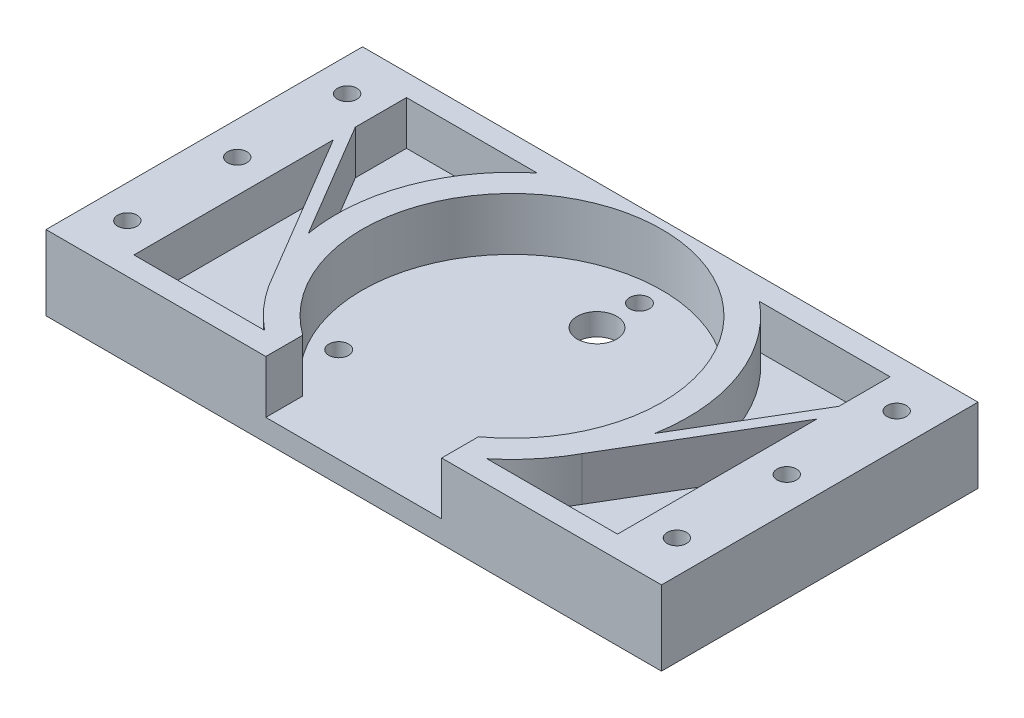
ISO-10303-21;
HEADER;
FILE_DESCRIPTION(('STEP AP214'),'2;1');
FILE_NAME('part.step','',(''),(''),'','','');
FILE_SCHEMA(('AUTOMOTIVE_DESIGN { 1 0 10303 214 1 1 1 1 }'));
ENDSEC;
DATA;
#1=APPLICATION_CONTEXT('core data for automotive mechanical design processes');
#2=APPLICATION_PROTOCOL_DEFINITION('international standard','automotive_design',2000,#1);
#3=PRODUCT_CONTEXT('',#1,'mechanical');
#4=PRODUCT('Part','Part','',(#3));
#5=PRODUCT_RELATED_PRODUCT_CATEGORY('part','',(#4));
#6=PRODUCT_DEFINITION_FORMATION('','',#4);
#7=PRODUCT_DEFINITION_CONTEXT('part definition',#1,'design');
#8=PRODUCT_DEFINITION('design','',#6,#7);
#9=PRODUCT_DEFINITION_SHAPE('','',#8);
#10=(LENGTH_UNIT() NAMED_UNIT(*) SI_UNIT(.MILLI.,.METRE.));
#11=(NAMED_UNIT(*) PLANE_ANGLE_UNIT() SI_UNIT($,.RADIAN.));
#12=(NAMED_UNIT(*) SI_UNIT($,.STERADIAN.) SOLID_ANGLE_UNIT());
#13=UNCERTAINTY_MEASURE_WITH_UNIT(LENGTH_MEASURE(1.E-05),#10,'distance_accuracy_value','');
#14=(GEOMETRIC_REPRESENTATION_CONTEXT(3) GLOBAL_UNCERTAINTY_ASSIGNED_CONTEXT((#13)) GLOBAL_UNIT_ASSIGNED_CONTEXT((#10,
#11,#12)) REPRESENTATION_CONTEXT('',''));
#15=CARTESIAN_POINT('',(0.,0.,0.));
#16=DIRECTION('',(0.,0.,1.));
#17=DIRECTION('',(1.,0.,0.));
#18=AXIS2_PLACEMENT_3D('',#15,#16,#17);
#19=CARTESIAN_POINT('',(70.,17.,-36.));
#20=DIRECTION('',(-1.,0.,0.));
#21=DIRECTION('',(0.,0.,1.));
#22=AXIS2_PLACEMENT_3D('',#19,#20,#21);
#23=PLANE('',#22);
#24=DIRECTION('',(0.,0.,-1.));
#25=VECTOR('',#24,1.);
#26=CARTESIAN_POINT('',(70.,0.,-36.));
#27=LINE('',#26,#25);
#28=CARTESIAN_POINT('',(70.,0.,36.));
#29=VERTEX_POINT('',#28);
#30=CARTESIAN_POINT('',(70.,0.,-36.));
#31=VERTEX_POINT('',#30);
#32=EDGE_CURVE('E498',#29,#31,#27,.T.);
#33=ORIENTED_EDGE('',*,*,#32,.T.);
#34=DIRECTION('',(0.,-1.,0.));
#35=VECTOR('',#34,1.);
#36=CARTESIAN_POINT('',(70.,17.,-36.));
#37=LINE('',#36,#35);
#38=CARTESIAN_POINT('',(70.,17.,-36.));
#39=VERTEX_POINT('',#38);
#40=EDGE_CURVE('E11',#39,#31,#37,.T.);
#41=ORIENTED_EDGE('',*,*,#40,.F.);
#42=DIRECTION('',(0.,0.,-1.));
#43=VECTOR('',#42,1.);
#44=CARTESIAN_POINT('',(70.,17.,-36.));
#45=LINE('',#44,#43);
#46=CARTESIAN_POINT('',(70.,17.,36.));
#47=VERTEX_POINT('',#46);
#48=EDGE_CURVE('E502',#47,#39,#45,.T.);
#49=ORIENTED_EDGE('',*,*,#48,.F.);
#50=DIRECTION('',(0.,-1.,0.));
#51=VECTOR('',#50,1.);
#52=CARTESIAN_POINT('',(70.,17.,36.));
#53=LINE('',#52,#51);
#54=EDGE_CURVE('E518',#47,#29,#53,.T.);
#55=ORIENTED_EDGE('',*,*,#54,.T.);
#56=EDGE_LOOP('',(#33,#41,#49,#55));
#57=FACE_BOUND('',#56,.T.);
#58=ADVANCED_FACE('F39',(#57),#23,.F.);
#59=CARTESIAN_POINT('',(-70.,17.,-36.));
#60=DIRECTION('',(0.,0.,1.));
#61=DIRECTION('',(1.,0.,0.));
#62=AXIS2_PLACEMENT_3D('',#59,#60,#61);
#63=PLANE('',#62);
#64=DIRECTION('',(-1.,0.,0.));
#65=VECTOR('',#64,1.);
#66=CARTESIAN_POINT('',(-70.,0.,-36.));
#67=LINE('',#66,#65);
#68=CARTESIAN_POINT('',(-70.,0.,-36.));
#69=VERTEX_POINT('',#68);
#70=EDGE_CURVE('E522',#31,#69,#67,.T.);
#71=ORIENTED_EDGE('',*,*,#70,.T.);
#72=DIRECTION('',(0.,-1.,0.));
#73=VECTOR('',#72,1.);
#74=CARTESIAN_POINT('',(-70.,17.,-36.));
#75=LINE('',#74,#73);
#76=CARTESIAN_POINT('',(-70.,17.,-36.));
#77=VERTEX_POINT('',#76);
#78=EDGE_CURVE('E47',#77,#69,#75,.T.);
#79=ORIENTED_EDGE('',*,*,#78,.F.);
#80=DIRECTION('',(-1.,0.,0.));
#81=VECTOR('',#80,1.);
#82=CARTESIAN_POINT('',(-70.,17.,-36.));
#83=LINE('',#82,#81);
#84=EDGE_CURVE('E506',#39,#77,#83,.T.);
#85=ORIENTED_EDGE('',*,*,#84,.F.);
#86=ORIENTED_EDGE('',*,*,#40,.T.);
#87=EDGE_LOOP('',(#71,#79,#85,#86));
#88=FACE_BOUND('',#87,.T.);
#89=ADVANCED_FACE('F588',(#88),#63,.F.);
#90=CARTESIAN_POINT('',(-70.,17.,-36.));
#91=DIRECTION('',(1.,0.,0.));
#92=DIRECTION('',(0.,0.,-1.));
#93=AXIS2_PLACEMENT_3D('',#90,#91,#92);
#94=PLANE('',#93);
#95=DIRECTION('',(0.,0.,1.));
#96=VECTOR('',#95,1.);
#97=CARTESIAN_POINT('',(-70.,0.,-36.));
#98=LINE('',#97,#96);
#99=CARTESIAN_POINT('',(-70.,0.,36.));
#100=VERTEX_POINT('',#99);
#101=EDGE_CURVE('E525',#69,#100,#98,.T.);
#102=ORIENTED_EDGE('',*,*,#101,.T.);
#103=DIRECTION('',(0.,-1.,0.));
#104=VECTOR('',#103,1.);
#105=CARTESIAN_POINT('',(-70.,17.,36.));
#106=LINE('',#105,#104);
#107=CARTESIAN_POINT('',(-70.,17.,36.));
#108=VERTEX_POINT('',#107);
#109=EDGE_CURVE('E533',#108,#100,#106,.T.);
#110=ORIENTED_EDGE('',*,*,#109,.F.);
#111=DIRECTION('',(0.,0.,1.));
#112=VECTOR('',#111,1.);
#113=CARTESIAN_POINT('',(-70.,17.,-36.));
#114=LINE('',#113,#112);
#115=EDGE_CURVE('E510',#77,#108,#114,.T.);
#116=ORIENTED_EDGE('',*,*,#115,.F.);
#117=ORIENTED_EDGE('',*,*,#78,.T.);
#118=EDGE_LOOP('',(#102,#110,#116,#117));
#119=FACE_BOUND('',#118,.T.);
#120=ADVANCED_FACE('F542',(#119),#94,.F.);
#121=CARTESIAN_POINT('',(-70.,17.,36.));
#122=DIRECTION('',(0.,0.,-1.));
#123=DIRECTION('',(-1.,0.,0.));
#124=AXIS2_PLACEMENT_3D('',#121,#122,#123);
#125=PLANE('',#124);
#126=DIRECTION('',(1.,0.,0.));
#127=VECTOR('',#126,1.);
#128=CARTESIAN_POINT('',(-70.,17.,36.));
#129=LINE('',#128,#127);
#130=CARTESIAN_POINT('',(20.,17.,36.));
#131=VERTEX_POINT('',#130);
#132=EDGE_CURVE('E513',#131,#47,#129,.T.);
#133=ORIENTED_EDGE('',*,*,#132,.F.);
#134=DIRECTION('',(0.,1.,0.));
#135=VECTOR('',#134,1.);
#136=CARTESIAN_POINT('',(20.,29.,36.));
#137=LINE('',#136,#135);
#138=CARTESIAN_POINT('',(20.,5.00000000000002,36.));
#139=VERTEX_POINT('',#138);
#140=EDGE_CURVE('E459',#139,#131,#137,.T.);
#141=ORIENTED_EDGE('',*,*,#140,.F.);
#142=DIRECTION('',(1.,0.,0.));
#143=VECTOR('',#142,1.);
#144=CARTESIAN_POINT('',(-20.,5.00000000000001,36.));
#145=LINE('',#144,#143);
#146=CARTESIAN_POINT('',(-20.,5.00000000000001,36.));
#147=VERTEX_POINT('',#146);
#148=EDGE_CURVE('E469',#147,#139,#145,.T.);
#149=ORIENTED_EDGE('',*,*,#148,.F.);
#150=DIRECTION('',(0.,-1.,0.));
#151=VECTOR('',#150,1.);
#152=CARTESIAN_POINT('',(-20.,29.,36.));
#153=LINE('',#152,#151);
#154=CARTESIAN_POINT('',(-20.,17.,36.));
#155=VERTEX_POINT('',#154);
#156=EDGE_CURVE('E465',#155,#147,#153,.T.);
#157=ORIENTED_EDGE('',*,*,#156,.F.);
#158=EDGE_CURVE('E514',#108,#155,#129,.T.);
#159=ORIENTED_EDGE('',*,*,#158,.F.);
#160=ORIENTED_EDGE('',*,*,#109,.T.);
#161=DIRECTION('',(1.,0.,0.));
#162=VECTOR('',#161,1.);
#163=CARTESIAN_POINT('',(-70.,0.,36.));
#164=LINE('',#163,#162);
#165=EDGE_CURVE('E507',#100,#29,#164,.T.);
#166=ORIENTED_EDGE('',*,*,#165,.T.);
#167=ORIENTED_EDGE('',*,*,#54,.F.);
#168=EDGE_LOOP('',(#133,#141,#149,#157,#159,#160,#166,#167));
#169=FACE_BOUND('',#168,.T.);
#170=ADVANCED_FACE('F552',(#169),#125,.F.);
#171=CARTESIAN_POINT('',(0.,17.,0.));
#172=DIRECTION('',(0.,1.,0.));
#173=DIRECTION('',(0.,0.,1.));
#174=AXIS2_PLACEMENT_3D('',#171,#172,#173);
#175=PLANE('',#174);
#176=DIRECTION('',(0.,0.,1.));
#177=VECTOR('',#176,1.);
#178=CARTESIAN_POINT('',(-55.,17.,-31.));
#179=LINE('',#178,#177);
#180=CARTESIAN_POINT('',(-55.,17.,-31.));
#181=VERTEX_POINT('',#180);
#182=CARTESIAN_POINT('',(-55.,17.,-19.3549850901077));
#183=VERTEX_POINT('',#182);
#184=EDGE_CURVE('E54',#181,#183,#179,.T.);
#185=ORIENTED_EDGE('',*,*,#184,.F.);
#186=DIRECTION('',(-1.,0.,0.));
#187=VECTOR('',#186,1.);
#188=CARTESIAN_POINT('',(-55.,17.,-31.));
#189=LINE('',#188,#187);
#190=CARTESIAN_POINT('',(-25.2784493195291,17.,-31.));
#191=VERTEX_POINT('',#190);
#192=EDGE_CURVE('E259',#191,#181,#189,.T.);
#193=ORIENTED_EDGE('',*,*,#192,.F.);
#194=CARTESIAN_POINT('',(0.,17.,0.));
#195=DIRECTION('',(0.,-1.,0.));
#196=DIRECTION('',(0.,0.,1.));
#197=AXIS2_PLACEMENT_3D('',#194,#195,#196);
#198=CIRCLE('',#197,40.);
#199=CARTESIAN_POINT('',(-39.3913346793757,17.,6.95145683849146));
#200=VERTEX_POINT('',#199);
#201=EDGE_CURVE('E279',#200,#191,#198,.T.);
#202=ORIENTED_EDGE('',*,*,#201,.F.);
#203=DIRECTION('',(0.510278058731334,0.,0.860009478306711));
#204=VECTOR('',#203,1.);
#205=CARTESIAN_POINT('',(-55.,17.,-19.3549850901077));
#206=LINE('',#205,#204);
#207=EDGE_CURVE('E274',#183,#200,#206,.T.);
#208=ORIENTED_EDGE('',*,*,#207,.F.);
#209=EDGE_LOOP('',(#185,#193,#202,#208));
#210=FACE_BOUND('',#209,.T.);
#211=DIRECTION('',(0.,0.,-1.));
#212=VECTOR('',#211,1.);
#213=CARTESIAN_POINT('',(55.,17.,-14.3549850901077));
#214=LINE('',#213,#212);
#215=CARTESIAN_POINT('',(55.,17.,31.));
#216=VERTEX_POINT('',#215);
#217=CARTESIAN_POINT('',(55.,17.,-14.3549850901077));
#218=VERTEX_POINT('',#217);
#219=EDGE_CURVE('E62',#216,#218,#214,.T.);
#220=ORIENTED_EDGE('',*,*,#219,.F.);
#221=DIRECTION('',(1.,0.,0.));
#222=VECTOR('',#221,1.);
#223=CARTESIAN_POINT('',(55.,17.,31.));
#224=LINE('',#223,#222);
#225=CARTESIAN_POINT('',(25.2784493195291,17.,31.));
#226=VERTEX_POINT('',#225);
#227=EDGE_CURVE('E303',#226,#216,#224,.T.);
#228=ORIENTED_EDGE('',*,*,#227,.F.);
#229=CARTESIAN_POINT('',(0.,17.,0.));
#230=DIRECTION('',(0.,-1.,0.));
#231=DIRECTION('',(0.,0.,1.));
#232=AXIS2_PLACEMENT_3D('',#229,#230,#231);
#233=CIRCLE('',#232,40.);
#234=CARTESIAN_POINT('',(35.0937617861387,17.,19.1944753431228));
#235=VERTEX_POINT('',#234);
#236=EDGE_CURVE('E322',#235,#226,#233,.T.);
#237=ORIENTED_EDGE('',*,*,#236,.F.);
#238=DIRECTION('',(-0.510278058731321,0.,0.860009478306719));
#239=VECTOR('',#238,1.);
#240=CARTESIAN_POINT('',(55.,17.,-14.3549850901077));
#241=LINE('',#240,#239);
#242=EDGE_CURVE('E318',#218,#235,#241,.T.);
#243=ORIENTED_EDGE('',*,*,#242,.F.);
#244=EDGE_LOOP('',(#220,#228,#237,#243));
#245=FACE_BOUND('',#244,.T.);
#246=DIRECTION('',(-1.,0.,0.));
#247=VECTOR('',#246,1.);
#248=CARTESIAN_POINT('',(55.,17.,-31.));
#249=LINE('',#248,#247);
#250=CARTESIAN_POINT('',(55.,17.,-31.));
#251=VERTEX_POINT('',#250);
#252=CARTESIAN_POINT('',(25.2784493195291,17.,-31.));
#253=VERTEX_POINT('',#252);
#254=EDGE_CURVE('E207',#251,#253,#249,.T.);
#255=ORIENTED_EDGE('',*,*,#254,.F.);
#256=DIRECTION('',(0.,0.,-1.));
#257=VECTOR('',#256,1.);
#258=CARTESIAN_POINT('',(55.,17.,-31.));
#259=LINE('',#258,#257);
#260=CARTESIAN_POINT('',(55.,17.,-19.3549850901077));
#261=VERTEX_POINT('',#260);
#262=EDGE_CURVE('E227',#261,#251,#259,.T.);
#263=ORIENTED_EDGE('',*,*,#262,.F.);
#264=DIRECTION('',(0.510278058731334,0.,-0.860009478306711));
#265=VECTOR('',#264,1.);
#266=CARTESIAN_POINT('',(55.,17.,-19.3549850901077));
#267=LINE('',#266,#265);
#268=CARTESIAN_POINT('',(39.3913346793757,17.,6.95145683849148));
#269=VERTEX_POINT('',#268);
#270=EDGE_CURVE('E231',#269,#261,#267,.T.);
#271=ORIENTED_EDGE('',*,*,#270,.F.);
#272=CARTESIAN_POINT('',(0.,17.,0.));
#273=DIRECTION('',(0.,-1.,0.));
#274=DIRECTION('',(0.,0.,1.));
#275=AXIS2_PLACEMENT_3D('',#272,#273,#274);
#276=CIRCLE('',#275,40.);
#277=EDGE_CURVE('E240',#253,#269,#276,.T.);
#278=ORIENTED_EDGE('',*,*,#277,.F.);
#279=EDGE_LOOP('',(#255,#263,#271,#278));
#280=FACE_BOUND('',#279,.T.);
#281=DIRECTION('',(0.,0.,1.));
#282=VECTOR('',#281,1.);
#283=CARTESIAN_POINT('',(-55.,17.,-14.3549850901077));
#284=LINE('',#283,#282);
#285=CARTESIAN_POINT('',(-55.,17.,-14.3549850901077));
#286=VERTEX_POINT('',#285);
#287=CARTESIAN_POINT('',(-55.,17.,31.));
#288=VERTEX_POINT('',#287);
#289=EDGE_CURVE('E289',#286,#288,#284,.T.);
#290=ORIENTED_EDGE('',*,*,#289,.F.);
#291=DIRECTION('',(-0.510278058731321,0.,-0.860009478306719));
#292=VECTOR('',#291,1.);
#293=CARTESIAN_POINT('',(-55.,17.,-14.3549850901077));
#294=LINE('',#293,#292);
#295=CARTESIAN_POINT('',(-35.0937617861387,17.,19.1944753431228));
#296=VERTEX_POINT('',#295);
#297=EDGE_CURVE('E344',#296,#286,#294,.T.);
#298=ORIENTED_EDGE('',*,*,#297,.F.);
#299=CARTESIAN_POINT('',(0.,17.,0.));
#300=DIRECTION('',(0.,-1.,0.));
#301=DIRECTION('',(0.,0.,1.));
#302=AXIS2_PLACEMENT_3D('',#299,#300,#301);
#303=CIRCLE('',#302,40.);
#304=CARTESIAN_POINT('',(-25.2784493195291,17.,31.));
#305=VERTEX_POINT('',#304);
#306=EDGE_CURVE('E363',#305,#296,#303,.T.);
#307=ORIENTED_EDGE('',*,*,#306,.F.);
#308=DIRECTION('',(1.,0.,0.));
#309=VECTOR('',#308,1.);
#310=CARTESIAN_POINT('',(-55.,17.,31.));
#311=LINE('',#310,#309);
#312=EDGE_CURVE('E359',#288,#305,#311,.T.);
#313=ORIENTED_EDGE('',*,*,#312,.F.);
#314=EDGE_LOOP('',(#290,#298,#307,#313));
#315=FACE_BOUND('',#314,.T.);
#316=CARTESIAN_POINT('',(62.5,17.,-25.));
#317=DIRECTION('',(0.,1.,0.));
#318=DIRECTION('',(0.,0.,-1.));
#319=AXIS2_PLACEMENT_3D('',#316,#317,#318);
#320=CIRCLE('',#319,2.2);
#321=CARTESIAN_POINT('',(62.5,17.,-27.2));
#322=VERTEX_POINT('',#321);
#323=EDGE_CURVE('E387',#322,#322,#320,.T.);
#324=ORIENTED_EDGE('',*,*,#323,.F.);
#325=EDGE_LOOP('',(#324));
#326=FACE_BOUND('',#325,.T.);
#327=CARTESIAN_POINT('',(62.5,17.,0.));
#328=DIRECTION('',(0.,1.,0.));
#329=DIRECTION('',(0.,0.,-1.));
#330=AXIS2_PLACEMENT_3D('',#327,#328,#329);
#331=CIRCLE('',#330,2.2);
#332=CARTESIAN_POINT('',(62.5,17.,-2.2));
#333=VERTEX_POINT('',#332);
#334=EDGE_CURVE('E444',#333,#333,#331,.T.);
#335=ORIENTED_EDGE('',*,*,#334,.F.);
#336=EDGE_LOOP('',(#335));
#337=FACE_BOUND('',#336,.T.);
#338=CARTESIAN_POINT('',(62.5,17.,25.));
#339=DIRECTION('',(0.,1.,0.));
#340=DIRECTION('',(0.,0.,-1.));
#341=AXIS2_PLACEMENT_3D('',#338,#339,#340);
#342=CIRCLE('',#341,2.2);
#343=CARTESIAN_POINT('',(62.5,17.,22.8));
#344=VERTEX_POINT('',#343);
#345=EDGE_CURVE('E436',#344,#344,#342,.T.);
#346=ORIENTED_EDGE('',*,*,#345,.F.);
#347=EDGE_LOOP('',(#346));
#348=FACE_BOUND('',#347,.T.);
#349=CARTESIAN_POINT('',(-62.5,17.,25.));
#350=DIRECTION('',(0.,1.,0.));
#351=DIRECTION('',(0.,0.,1.));
#352=AXIS2_PLACEMENT_3D('',#349,#350,#351);
#353=CIRCLE('',#352,2.2);
#354=CARTESIAN_POINT('',(-62.5,17.,27.2));
#355=VERTEX_POINT('',#354);
#356=EDGE_CURVE('E428',#355,#355,#353,.T.);
#357=ORIENTED_EDGE('',*,*,#356,.F.);
#358=EDGE_LOOP('',(#357));
#359=FACE_BOUND('',#358,.T.);
#360=CARTESIAN_POINT('',(-62.5,17.,0.));
#361=DIRECTION('',(0.,1.,0.));
#362=DIRECTION('',(0.,0.,1.));
#363=AXIS2_PLACEMENT_3D('',#360,#361,#362);
#364=CIRCLE('',#363,2.2);
#365=CARTESIAN_POINT('',(-62.5,17.,2.2));
#366=VERTEX_POINT('',#365);
#367=EDGE_CURVE('E420',#366,#366,#364,.T.);
#368=ORIENTED_EDGE('',*,*,#367,.F.);
#369=EDGE_LOOP('',(#368));
#370=FACE_BOUND('',#369,.T.);
#371=CARTESIAN_POINT('',(-62.5,17.,-25.));
#372=DIRECTION('',(0.,1.,0.));
#373=DIRECTION('',(0.,0.,1.));
#374=AXIS2_PLACEMENT_3D('',#371,#372,#373);
#375=CIRCLE('',#374,2.2);
#376=CARTESIAN_POINT('',(-62.5,17.,-22.8));
#377=VERTEX_POINT('',#376);
#378=EDGE_CURVE('E419',#377,#377,#375,.T.);
#379=ORIENTED_EDGE('',*,*,#378,.F.);
#380=EDGE_LOOP('',(#379));
#381=FACE_BOUND('',#380,.T.);
#382=DIRECTION('',(0.,0.,-1.));
#383=VECTOR('',#382,1.);
#384=CARTESIAN_POINT('',(20.,17.,0.));
#385=LINE('',#384,#383);
#386=CARTESIAN_POINT('',(20.,17.,27.6190151888151));
#387=VERTEX_POINT('',#386);
#388=EDGE_CURVE('E490',#131,#387,#385,.T.);
#389=ORIENTED_EDGE('',*,*,#388,.F.);
#390=ORIENTED_EDGE('',*,*,#132,.T.);
#391=ORIENTED_EDGE('',*,*,#48,.T.);
#392=ORIENTED_EDGE('',*,*,#84,.T.);
#393=ORIENTED_EDGE('',*,*,#115,.T.);
#394=ORIENTED_EDGE('',*,*,#158,.T.);
#395=DIRECTION('',(0.,0.,1.));
#396=VECTOR('',#395,1.);
#397=CARTESIAN_POINT('',(-20.,17.,0.));
#398=LINE('',#397,#396);
#399=CARTESIAN_POINT('',(-20.,17.,27.6190151888152));
#400=VERTEX_POINT('',#399);
#401=EDGE_CURVE('E483',#400,#155,#398,.T.);
#402=ORIENTED_EDGE('',*,*,#401,.F.);
#403=CARTESIAN_POINT('',(0.,17.,0.));
#404=DIRECTION('',(0.,1.,0.));
#405=DIRECTION('',(0.,0.,1.));
#406=AXIS2_PLACEMENT_3D('',#403,#404,#405);
#407=CIRCLE('',#406,34.1);
#408=EDGE_CURVE('E493',#387,#400,#407,.T.);
#409=ORIENTED_EDGE('',*,*,#408,.F.);
#410=EDGE_LOOP('',(#389,#390,#391,#392,#393,#394,#402,#409));
#411=FACE_BOUND('',#410,.T.);
#412=ADVANCED_FACE('F559',(#210,#245,#280,#315,#326,#337,#348,#359,#370,#381,#411),#175,.T.);
#413=CARTESIAN_POINT('',(0.,0.,0.));
#414=DIRECTION('',(0.,1.,0.));
#415=DIRECTION('',(0.,0.,1.));
#416=AXIS2_PLACEMENT_3D('',#413,#414,#415);
#417=PLANE('',#416);
#418=CARTESIAN_POINT('',(0.,0.,-29.));
#419=DIRECTION('',(0.,1.,0.));
#420=DIRECTION('',(0.,0.,1.));
#421=AXIS2_PLACEMENT_3D('',#418,#419,#420);
#422=CIRCLE('',#421,2.25);
#423=CARTESIAN_POINT('',(0.,0.,-26.75));
#424=VERTEX_POINT('',#423);
#425=EDGE_CURVE('E383',#424,#424,#422,.T.);
#426=ORIENTED_EDGE('',*,*,#425,.T.);
#427=EDGE_LOOP('',(#426));
#428=FACE_BOUND('',#427,.T.);
#429=CARTESIAN_POINT('',(0.,0.,-19.3335926358097));
#430=DIRECTION('',(0.,1.,0.));
#431=DIRECTION('',(0.,0.,1.));
#432=AXIS2_PLACEMENT_3D('',#429,#430,#431);
#433=CIRCLE('',#432,4.5);
#434=CARTESIAN_POINT('',(0.,0.,-14.8335926358097));
#435=VERTEX_POINT('',#434);
#436=EDGE_CURVE('E392',#435,#435,#433,.T.);
#437=ORIENTED_EDGE('',*,*,#436,.T.);
#438=EDGE_LOOP('',(#437));
#439=FACE_BOUND('',#438,.T.);
#440=CARTESIAN_POINT('',(25.0423433635701,0.,14.3746110462845));
#441=DIRECTION('',(0.,1.,0.));
#442=DIRECTION('',(0.,0.,1.));
#443=AXIS2_PLACEMENT_3D('',#440,#441,#442);
#444=CIRCLE('',#443,2.25);
#445=CARTESIAN_POINT('',(25.0423433635701,0.,16.6246110462845));
#446=VERTEX_POINT('',#445);
#447=EDGE_CURVE('E400',#446,#446,#444,.T.);
#448=ORIENTED_EDGE('',*,*,#447,.T.);
#449=EDGE_LOOP('',(#448));
#450=FACE_BOUND('',#449,.T.);
#451=CARTESIAN_POINT('',(-25.0423433635664,0.,14.3746110462866));
#452=DIRECTION('',(0.,1.,0.));
#453=DIRECTION('',(0.,0.,1.));
#454=AXIS2_PLACEMENT_3D('',#451,#452,#453);
#455=CIRCLE('',#454,2.25);
#456=CARTESIAN_POINT('',(-25.0423433635664,0.,16.6246110462866));
#457=VERTEX_POINT('',#456);
#458=EDGE_CURVE('E408',#457,#457,#455,.T.);
#459=ORIENTED_EDGE('',*,*,#458,.T.);
#460=EDGE_LOOP('',(#459));
#461=FACE_BOUND('',#460,.T.);
#462=CARTESIAN_POINT('',(62.5,0.,-25.));
#463=DIRECTION('',(0.,1.,0.));
#464=DIRECTION('',(0.,0.,-1.));
#465=AXIS2_PLACEMENT_3D('',#462,#463,#464);
#466=CIRCLE('',#465,2.2);
#467=CARTESIAN_POINT('',(62.5,0.,-27.2));
#468=VERTEX_POINT('',#467);
#469=EDGE_CURVE('E448',#468,#468,#466,.T.);
#470=ORIENTED_EDGE('',*,*,#469,.T.);
#471=EDGE_LOOP('',(#470));
#472=FACE_BOUND('',#471,.T.);
#473=CARTESIAN_POINT('',(62.5,0.,0.));
#474=DIRECTION('',(0.,1.,0.));
#475=DIRECTION('',(0.,0.,-1.));
#476=AXIS2_PLACEMENT_3D('',#473,#474,#475);
#477=CIRCLE('',#476,2.2);
#478=CARTESIAN_POINT('',(62.5,0.,-2.2));
#479=VERTEX_POINT('',#478);
#480=EDGE_CURVE('E440',#479,#479,#477,.T.);
#481=ORIENTED_EDGE('',*,*,#480,.T.);
#482=EDGE_LOOP('',(#481));
#483=FACE_BOUND('',#482,.T.);
#484=CARTESIAN_POINT('',(62.5,0.,25.));
#485=DIRECTION('',(0.,1.,0.));
#486=DIRECTION('',(0.,0.,-1.));
#487=AXIS2_PLACEMENT_3D('',#484,#485,#486);
#488=CIRCLE('',#487,2.2);
#489=CARTESIAN_POINT('',(62.5,0.,22.8));
#490=VERTEX_POINT('',#489);
#491=EDGE_CURVE('E432',#490,#490,#488,.T.);
#492=ORIENTED_EDGE('',*,*,#491,.T.);
#493=EDGE_LOOP('',(#492));
#494=FACE_BOUND('',#493,.T.);
#495=CARTESIAN_POINT('',(-62.5,0.,25.));
#496=DIRECTION('',(0.,1.,0.));
#497=DIRECTION('',(0.,0.,1.));
#498=AXIS2_PLACEMENT_3D('',#495,#496,#497);
#499=CIRCLE('',#498,2.2);
#500=CARTESIAN_POINT('',(-62.5,0.,27.2));
#501=VERTEX_POINT('',#500);
#502=EDGE_CURVE('E424',#501,#501,#499,.T.);
#503=ORIENTED_EDGE('',*,*,#502,.T.);
#504=EDGE_LOOP('',(#503));
#505=FACE_BOUND('',#504,.T.);
#506=CARTESIAN_POINT('',(-62.5,0.,0.));
#507=DIRECTION('',(0.,1.,0.));
#508=DIRECTION('',(0.,0.,1.));
#509=AXIS2_PLACEMENT_3D('',#506,#507,#508);
#510=CIRCLE('',#509,2.2);
#511=CARTESIAN_POINT('',(-62.5,0.,2.2));
#512=VERTEX_POINT('',#511);
#513=EDGE_CURVE('E415',#512,#512,#510,.T.);
#514=ORIENTED_EDGE('',*,*,#513,.T.);
#515=EDGE_LOOP('',(#514));
#516=FACE_BOUND('',#515,.T.);
#517=CARTESIAN_POINT('',(-62.5,0.,-25.));
#518=DIRECTION('',(0.,1.,0.));
#519=DIRECTION('',(0.,0.,1.));
#520=AXIS2_PLACEMENT_3D('',#517,#518,#519);
#521=CIRCLE('',#520,2.2);
#522=CARTESIAN_POINT('',(-62.5,0.,-22.8));
#523=VERTEX_POINT('',#522);
#524=EDGE_CURVE('E455',#523,#523,#521,.T.);
#525=ORIENTED_EDGE('',*,*,#524,.T.);
#526=EDGE_LOOP('',(#525));
#527=FACE_BOUND('',#526,.T.);
#528=ORIENTED_EDGE('',*,*,#32,.F.);
#529=ORIENTED_EDGE('',*,*,#165,.F.);
#530=ORIENTED_EDGE('',*,*,#101,.F.);
#531=ORIENTED_EDGE('',*,*,#70,.F.);
#532=EDGE_LOOP('',(#528,#529,#530,#531));
#533=FACE_BOUND('',#532,.T.);
#534=ADVANCED_FACE('F548',(#428,#439,#450,#461,#472,#483,#494,#505,#516,#527,#533),#417,.F.);
#535=CARTESIAN_POINT('',(0.,5.,0.));
#536=DIRECTION('',(0.,1.,0.));
#537=DIRECTION('',(0.,0.,1.));
#538=AXIS2_PLACEMENT_3D('',#535,#536,#537);
#539=CYLINDRICAL_SURFACE('',#538,34.1);
#540=CARTESIAN_POINT('',(0.,5.,0.));
#541=DIRECTION('',(0.,1.,0.));
#542=DIRECTION('',(0.,0.,1.));
#543=AXIS2_PLACEMENT_3D('',#540,#541,#542);
#544=CIRCLE('',#543,34.1);
#545=CARTESIAN_POINT('',(20.,5.00000000000002,27.6190151888151));
#546=VERTEX_POINT('',#545);
#547=CARTESIAN_POINT('',(-20.,5.,27.6190151888152));
#548=VERTEX_POINT('',#547);
#549=EDGE_CURVE('E494',#546,#548,#544,.T.);
#550=ORIENTED_EDGE('',*,*,#549,.F.);
#551=DIRECTION('',(0.,1.,0.));
#552=VECTOR('',#551,1.);
#553=CARTESIAN_POINT('',(20.,5.00000000000001,27.6190151888151));
#554=LINE('',#553,#552);
#555=EDGE_CURVE('E486',#546,#387,#554,.T.);
#556=ORIENTED_EDGE('',*,*,#555,.T.);
#557=ORIENTED_EDGE('',*,*,#408,.T.);
#558=DIRECTION('',(0.,1.,0.));
#559=VECTOR('',#558,1.);
#560=CARTESIAN_POINT('',(-20.,4.99999999999999,27.6190151888152));
#561=LINE('',#560,#559);
#562=EDGE_CURVE('E477',#400,#548,#561,.F.);
#563=ORIENTED_EDGE('',*,*,#562,.T.);
#564=EDGE_LOOP('',(#550,#556,#557,#563));
#565=FACE_BOUND('',#564,.T.);
#566=ADVANCED_FACE('F575',(#565),#539,.F.);
#567=CARTESIAN_POINT('',(0.,5.,0.));
#568=DIRECTION('',(0.,1.,0.));
#569=DIRECTION('',(0.,0.,1.));
#570=AXIS2_PLACEMENT_3D('',#567,#568,#569);
#571=PLANE('',#570);
#572=CARTESIAN_POINT('',(0.,5.,-29.));
#573=DIRECTION('',(0.,1.,0.));
#574=DIRECTION('',(0.,0.,1.));
#575=AXIS2_PLACEMENT_3D('',#572,#573,#574);
#576=CIRCLE('',#575,2.25);
#577=CARTESIAN_POINT('',(0.,5.,-26.75));
#578=VERTEX_POINT('',#577);
#579=EDGE_CURVE('E388',#578,#578,#576,.T.);
#580=ORIENTED_EDGE('',*,*,#579,.F.);
#581=EDGE_LOOP('',(#580));
#582=FACE_BOUND('',#581,.T.);
#583=CARTESIAN_POINT('',(0.,5.,-19.3335926358097));
#584=DIRECTION('',(0.,1.,0.));
#585=DIRECTION('',(0.,0.,1.));
#586=AXIS2_PLACEMENT_3D('',#583,#584,#585);
#587=CIRCLE('',#586,4.5);
#588=CARTESIAN_POINT('',(0.,5.,-14.8335926358097));
#589=VERTEX_POINT('',#588);
#590=EDGE_CURVE('E396',#589,#589,#587,.T.);
#591=ORIENTED_EDGE('',*,*,#590,.F.);
#592=EDGE_LOOP('',(#591));
#593=FACE_BOUND('',#592,.T.);
#594=CARTESIAN_POINT('',(25.0423433635701,5.,14.3746110462845));
#595=DIRECTION('',(0.,1.,0.));
#596=DIRECTION('',(0.,0.,1.));
#597=AXIS2_PLACEMENT_3D('',#594,#595,#596);
#598=CIRCLE('',#597,2.25);
#599=CARTESIAN_POINT('',(25.0423433635701,5.,16.6246110462845));
#600=VERTEX_POINT('',#599);
#601=EDGE_CURVE('E404',#600,#600,#598,.T.);
#602=ORIENTED_EDGE('',*,*,#601,.F.);
#603=EDGE_LOOP('',(#602));
#604=FACE_BOUND('',#603,.T.);
#605=CARTESIAN_POINT('',(-25.0423433635664,5.,14.3746110462866));
#606=DIRECTION('',(0.,1.,0.));
#607=DIRECTION('',(0.,0.,1.));
#608=AXIS2_PLACEMENT_3D('',#605,#606,#607);
#609=CIRCLE('',#608,2.25);
#610=CARTESIAN_POINT('',(-25.0423433635664,5.,16.6246110462866));
#611=VERTEX_POINT('',#610);
#612=EDGE_CURVE('E373',#611,#611,#609,.T.);
#613=ORIENTED_EDGE('',*,*,#612,.F.);
#614=EDGE_LOOP('',(#613));
#615=FACE_BOUND('',#614,.T.);
#616=ORIENTED_EDGE('',*,*,#549,.T.);
#617=DIRECTION('',(0.,0.,1.));
#618=VECTOR('',#617,1.);
#619=CARTESIAN_POINT('',(-20.,5.00000000000001,26.));
#620=LINE('',#619,#618);
#621=EDGE_CURVE('E473',#548,#147,#620,.T.);
#622=ORIENTED_EDGE('',*,*,#621,.T.);
#623=ORIENTED_EDGE('',*,*,#148,.T.);
#624=DIRECTION('',(0.,0.,1.));
#625=VECTOR('',#624,1.);
#626=CARTESIAN_POINT('',(20.,5.00000000000002,26.));
#627=LINE('',#626,#625);
#628=EDGE_CURVE('E474',#546,#139,#627,.T.);
#629=ORIENTED_EDGE('',*,*,#628,.F.);
#630=EDGE_LOOP('',(#616,#622,#623,#629));
#631=FACE_BOUND('',#630,.T.);
#632=ADVANCED_FACE('F570',(#582,#593,#604,#615,#631),#571,.T.);
#633=CARTESIAN_POINT('',(20.,29.,26.));
#634=DIRECTION('',(1.,0.,0.));
#635=DIRECTION('',(0.,1.,0.));
#636=AXIS2_PLACEMENT_3D('',#633,#634,#635);
#637=PLANE('',#636);
#638=ORIENTED_EDGE('',*,*,#388,.T.);
#639=ORIENTED_EDGE('',*,*,#555,.F.);
#640=ORIENTED_EDGE('',*,*,#628,.T.);
#641=ORIENTED_EDGE('',*,*,#140,.T.);
#642=EDGE_LOOP('',(#638,#639,#640,#641));
#643=FACE_BOUND('',#642,.T.);
#644=ADVANCED_FACE('F566',(#643),#637,.F.);
#645=CARTESIAN_POINT('',(-20.,29.,26.));
#646=DIRECTION('',(-1.,0.,0.));
#647=DIRECTION('',(0.,-1.,0.));
#648=AXIS2_PLACEMENT_3D('',#645,#646,#647);
#649=PLANE('',#648);
#650=ORIENTED_EDGE('',*,*,#401,.T.);
#651=ORIENTED_EDGE('',*,*,#156,.T.);
#652=ORIENTED_EDGE('',*,*,#621,.F.);
#653=ORIENTED_EDGE('',*,*,#562,.F.);
#654=EDGE_LOOP('',(#650,#651,#652,#653));
#655=FACE_BOUND('',#654,.T.);
#656=ADVANCED_FACE('F572',(#655),#649,.F.);
#657=CARTESIAN_POINT('',(-62.5,0.,-25.));
#658=DIRECTION('',(0.,1.,0.));
#659=DIRECTION('',(0.,0.,1.));
#660=AXIS2_PLACEMENT_3D('',#657,#658,#659);
#661=CYLINDRICAL_SURFACE('',#660,2.2);
#662=ORIENTED_EDGE('',*,*,#524,.F.);
#663=EDGE_LOOP('',(#662));
#664=FACE_BOUND('',#663,.T.);
#665=ORIENTED_EDGE('',*,*,#378,.T.);
#666=EDGE_LOOP('',(#665));
#667=FACE_BOUND('',#666,.T.);
#668=ADVANCED_FACE('F626',(#664,#667),#661,.F.);
#669=CARTESIAN_POINT('',(-62.5,0.,0.));
#670=DIRECTION('',(0.,1.,0.));
#671=DIRECTION('',(0.,0.,1.));
#672=AXIS2_PLACEMENT_3D('',#669,#670,#671);
#673=CYLINDRICAL_SURFACE('',#672,2.2);
#674=ORIENTED_EDGE('',*,*,#513,.F.);
#675=EDGE_LOOP('',(#674));
#676=FACE_BOUND('',#675,.T.);
#677=ORIENTED_EDGE('',*,*,#367,.T.);
#678=EDGE_LOOP('',(#677));
#679=FACE_BOUND('',#678,.T.);
#680=ADVANCED_FACE('F628',(#676,#679),#673,.F.);
#681=CARTESIAN_POINT('',(-62.5,0.,25.));
#682=DIRECTION('',(0.,1.,0.));
#683=DIRECTION('',(0.,0.,1.));
#684=AXIS2_PLACEMENT_3D('',#681,#682,#683);
#685=CYLINDRICAL_SURFACE('',#684,2.2);
#686=ORIENTED_EDGE('',*,*,#502,.F.);
#687=EDGE_LOOP('',(#686));
#688=FACE_BOUND('',#687,.T.);
#689=ORIENTED_EDGE('',*,*,#356,.T.);
#690=EDGE_LOOP('',(#689));
#691=FACE_BOUND('',#690,.T.);
#692=ADVANCED_FACE('F635',(#688,#691),#685,.F.);
#693=CARTESIAN_POINT('',(62.5,0.,25.));
#694=DIRECTION('',(0.,1.,0.));
#695=DIRECTION('',(0.,0.,1.));
#696=AXIS2_PLACEMENT_3D('',#693,#694,#695);
#697=CYLINDRICAL_SURFACE('',#696,2.2);
#698=ORIENTED_EDGE('',*,*,#491,.F.);
#699=EDGE_LOOP('',(#698));
#700=FACE_BOUND('',#699,.T.);
#701=ORIENTED_EDGE('',*,*,#345,.T.);
#702=EDGE_LOOP('',(#701));
#703=FACE_BOUND('',#702,.T.);
#704=ADVANCED_FACE('F672',(#700,#703),#697,.F.);
#705=CARTESIAN_POINT('',(62.5,0.,0.));
#706=DIRECTION('',(0.,1.,0.));
#707=DIRECTION('',(0.,0.,1.));
#708=AXIS2_PLACEMENT_3D('',#705,#706,#707);
#709=CYLINDRICAL_SURFACE('',#708,2.2);
#710=ORIENTED_EDGE('',*,*,#480,.F.);
#711=EDGE_LOOP('',(#710));
#712=FACE_BOUND('',#711,.T.);
#713=ORIENTED_EDGE('',*,*,#334,.T.);
#714=EDGE_LOOP('',(#713));
#715=FACE_BOUND('',#714,.T.);
#716=ADVANCED_FACE('F682',(#712,#715),#709,.F.);
#717=CARTESIAN_POINT('',(62.5,0.,-25.));
#718=DIRECTION('',(0.,1.,0.));
#719=DIRECTION('',(0.,0.,1.));
#720=AXIS2_PLACEMENT_3D('',#717,#718,#719);
#721=CYLINDRICAL_SURFACE('',#720,2.2);
#722=ORIENTED_EDGE('',*,*,#469,.F.);
#723=EDGE_LOOP('',(#722));
#724=FACE_BOUND('',#723,.T.);
#725=ORIENTED_EDGE('',*,*,#323,.T.);
#726=EDGE_LOOP('',(#725));
#727=FACE_BOUND('',#726,.T.);
#728=ADVANCED_FACE('F641',(#724,#727),#721,.F.);
#729=CARTESIAN_POINT('',(-25.0423433635664,0.,14.3746110462866));
#730=DIRECTION('',(0.,1.,0.));
#731=DIRECTION('',(0.,0.,1.));
#732=AXIS2_PLACEMENT_3D('',#729,#730,#731);
#733=CYLINDRICAL_SURFACE('',#732,2.25);
#734=ORIENTED_EDGE('',*,*,#458,.F.);
#735=EDGE_LOOP('',(#734));
#736=FACE_BOUND('',#735,.T.);
#737=ORIENTED_EDGE('',*,*,#612,.T.);
#738=EDGE_LOOP('',(#737));
#739=FACE_BOUND('',#738,.T.);
#740=ADVANCED_FACE('F700',(#736,#739),#733,.F.);
#741=CARTESIAN_POINT('',(25.0423433635701,0.,14.3746110462845));
#742=DIRECTION('',(0.,1.,0.));
#743=DIRECTION('',(0.,0.,1.));
#744=AXIS2_PLACEMENT_3D('',#741,#742,#743);
#745=CYLINDRICAL_SURFACE('',#744,2.25);
#746=ORIENTED_EDGE('',*,*,#447,.F.);
#747=EDGE_LOOP('',(#746));
#748=FACE_BOUND('',#747,.T.);
#749=ORIENTED_EDGE('',*,*,#601,.T.);
#750=EDGE_LOOP('',(#749));
#751=FACE_BOUND('',#750,.T.);
#752=ADVANCED_FACE('F722',(#748,#751),#745,.F.);
#753=CARTESIAN_POINT('',(0.,0.,-19.3335926358097));
#754=DIRECTION('',(0.,1.,0.));
#755=DIRECTION('',(0.,0.,1.));
#756=AXIS2_PLACEMENT_3D('',#753,#754,#755);
#757=CYLINDRICAL_SURFACE('',#756,4.5);
#758=ORIENTED_EDGE('',*,*,#436,.F.);
#759=EDGE_LOOP('',(#758));
#760=FACE_BOUND('',#759,.T.);
#761=ORIENTED_EDGE('',*,*,#590,.T.);
#762=EDGE_LOOP('',(#761));
#763=FACE_BOUND('',#762,.T.);
#764=ADVANCED_FACE('F732',(#760,#763),#757,.F.);
#765=CARTESIAN_POINT('',(0.,0.,-29.));
#766=DIRECTION('',(0.,1.,0.));
#767=DIRECTION('',(0.,0.,1.));
#768=AXIS2_PLACEMENT_3D('',#765,#766,#767);
#769=CYLINDRICAL_SURFACE('',#768,2.25);
#770=ORIENTED_EDGE('',*,*,#425,.F.);
#771=EDGE_LOOP('',(#770));
#772=FACE_BOUND('',#771,.T.);
#773=ORIENTED_EDGE('',*,*,#579,.T.);
#774=EDGE_LOOP('',(#773));
#775=FACE_BOUND('',#774,.T.);
#776=ADVANCED_FACE('F742',(#772,#775),#769,.F.);
#777=CARTESIAN_POINT('',(-55.,7.,-14.3549850901077));
#778=DIRECTION('',(-1.,0.,0.));
#779=DIRECTION('',(0.,0.,1.));
#780=AXIS2_PLACEMENT_3D('',#777,#778,#779);
#781=PLANE('',#780);
#782=ORIENTED_EDGE('',*,*,#289,.T.);
#783=DIRECTION('',(0.,1.,0.));
#784=VECTOR('',#783,1.);
#785=CARTESIAN_POINT('',(-55.,7.,31.));
#786=LINE('',#785,#784);
#787=CARTESIAN_POINT('',(-55.,7.,31.));
#788=VERTEX_POINT('',#787);
#789=EDGE_CURVE('E356',#788,#288,#786,.T.);
#790=ORIENTED_EDGE('',*,*,#789,.F.);
#791=DIRECTION('',(0.,0.,1.));
#792=VECTOR('',#791,1.);
#793=CARTESIAN_POINT('',(-55.,7.,-14.3549850901077));
#794=LINE('',#793,#792);
#795=CARTESIAN_POINT('',(-55.,7.,-14.3549850901077));
#796=VERTEX_POINT('',#795);
#797=EDGE_CURVE('E339',#796,#788,#794,.T.);
#798=ORIENTED_EDGE('',*,*,#797,.F.);
#799=DIRECTION('',(0.,1.,0.));
#800=VECTOR('',#799,1.);
#801=CARTESIAN_POINT('',(-55.,7.,-14.3549850901077));
#802=LINE('',#801,#800);
#803=EDGE_CURVE('E370',#796,#286,#802,.T.);
#804=ORIENTED_EDGE('',*,*,#803,.T.);
#805=EDGE_LOOP('',(#782,#790,#798,#804));
#806=FACE_BOUND('',#805,.T.);
#807=ADVANCED_FACE('F751',(#806),#781,.F.);
#808=CARTESIAN_POINT('',(-55.,7.,-14.3549850901077));
#809=DIRECTION('',(0.860009478306719,0.,-0.510278058731321));
#810=DIRECTION('',(-0.510278058731321,0.,-0.860009478306719));
#811=AXIS2_PLACEMENT_3D('',#808,#809,#810);
#812=PLANE('',#811);
#813=ORIENTED_EDGE('',*,*,#297,.T.);
#814=ORIENTED_EDGE('',*,*,#803,.F.);
#815=DIRECTION('',(-0.510278058731321,0.,-0.860009478306719));
#816=VECTOR('',#815,1.);
#817=CARTESIAN_POINT('',(-55.,7.,-14.3549850901077));
#818=LINE('',#817,#816);
#819=CARTESIAN_POINT('',(-35.0937617861387,7.,19.1944753431228));
#820=VERTEX_POINT('',#819);
#821=EDGE_CURVE('E352',#820,#796,#818,.T.);
#822=ORIENTED_EDGE('',*,*,#821,.F.);
#823=DIRECTION('',(0.,1.,0.));
#824=VECTOR('',#823,1.);
#825=CARTESIAN_POINT('',(-35.0937617861387,7.,19.1944753431228));
#826=LINE('',#825,#824);
#827=EDGE_CURVE('E374',#820,#296,#826,.T.);
#828=ORIENTED_EDGE('',*,*,#827,.T.);
#829=EDGE_LOOP('',(#813,#814,#822,#828));
#830=FACE_BOUND('',#829,.T.);
#831=ADVANCED_FACE('F766',(#830),#812,.F.);
#832=CARTESIAN_POINT('',(0.,7.,0.));
#833=DIRECTION('',(0.,1.,0.));
#834=DIRECTION('',(0.,0.,1.));
#835=AXIS2_PLACEMENT_3D('',#832,#833,#834);
#836=CYLINDRICAL_SURFACE('',#835,40.);
#837=ORIENTED_EDGE('',*,*,#306,.T.);
#838=ORIENTED_EDGE('',*,*,#827,.F.);
#839=CARTESIAN_POINT('',(0.,7.,0.));
#840=DIRECTION('',(0.,-1.,0.));
#841=DIRECTION('',(0.,0.,1.));
#842=AXIS2_PLACEMENT_3D('',#839,#840,#841);
#843=CIRCLE('',#842,40.);
#844=CARTESIAN_POINT('',(-25.2784493195291,7.,31.));
#845=VERTEX_POINT('',#844);
#846=EDGE_CURVE('E348',#845,#820,#843,.T.);
#847=ORIENTED_EDGE('',*,*,#846,.F.);
#848=DIRECTION('',(0.,1.,0.));
#849=VECTOR('',#848,1.);
#850=CARTESIAN_POINT('',(-25.2784493195291,7.,31.));
#851=LINE('',#850,#849);
#852=EDGE_CURVE('E377',#845,#305,#851,.T.);
#853=ORIENTED_EDGE('',*,*,#852,.T.);
#854=EDGE_LOOP('',(#837,#838,#847,#853));
#855=FACE_BOUND('',#854,.T.);
#856=ADVANCED_FACE('F776',(#855),#836,.T.);
#857=CARTESIAN_POINT('',(-55.,7.,31.));
#858=DIRECTION('',(0.,0.,1.));
#859=DIRECTION('',(1.,0.,0.));
#860=AXIS2_PLACEMENT_3D('',#857,#858,#859);
#861=PLANE('',#860);
#862=ORIENTED_EDGE('',*,*,#312,.T.);
#863=ORIENTED_EDGE('',*,*,#852,.F.);
#864=DIRECTION('',(1.,0.,0.));
#865=VECTOR('',#864,1.);
#866=CARTESIAN_POINT('',(-55.,7.,31.));
#867=LINE('',#866,#865);
#868=EDGE_CURVE('E343',#788,#845,#867,.T.);
#869=ORIENTED_EDGE('',*,*,#868,.F.);
#870=ORIENTED_EDGE('',*,*,#789,.T.);
#871=EDGE_LOOP('',(#862,#863,#869,#870));
#872=FACE_BOUND('',#871,.T.);
#873=ADVANCED_FACE('F786',(#872),#861,.F.);
#874=CARTESIAN_POINT('',(0.,7.,0.));
#875=DIRECTION('',(0.,1.,0.));
#876=DIRECTION('',(0.,0.,1.));
#877=AXIS2_PLACEMENT_3D('',#874,#875,#876);
#878=PLANE('',#877);
#879=ORIENTED_EDGE('',*,*,#797,.T.);
#880=ORIENTED_EDGE('',*,*,#868,.T.);
#881=ORIENTED_EDGE('',*,*,#846,.T.);
#882=ORIENTED_EDGE('',*,*,#821,.T.);
#883=EDGE_LOOP('',(#879,#880,#881,#882));
#884=FACE_BOUND('',#883,.T.);
#885=ADVANCED_FACE('F796',(#884),#878,.T.);
#886=CARTESIAN_POINT('',(55.,7.,-31.));
#887=DIRECTION('',(0.,0.,-1.));
#888=DIRECTION('',(-1.,0.,0.));
#889=AXIS2_PLACEMENT_3D('',#886,#887,#888);
#890=PLANE('',#889);
#891=ORIENTED_EDGE('',*,*,#254,.T.);
#892=DIRECTION('',(0.,1.,0.));
#893=VECTOR('',#892,1.);
#894=CARTESIAN_POINT('',(25.2784493195291,7.,-31.));
#895=LINE('',#894,#893);
#896=CARTESIAN_POINT('',(25.2784493195291,7.,-31.));
#897=VERTEX_POINT('',#896);
#898=EDGE_CURVE('E200',#897,#253,#895,.T.);
#899=ORIENTED_EDGE('',*,*,#898,.F.);
#900=DIRECTION('',(-1.,0.,0.));
#901=VECTOR('',#900,1.);
#902=CARTESIAN_POINT('',(55.,7.,-31.));
#903=LINE('',#902,#901);
#904=CARTESIAN_POINT('',(55.,7.,-31.));
#905=VERTEX_POINT('',#904);
#906=EDGE_CURVE('E204',#905,#897,#903,.T.);
#907=ORIENTED_EDGE('',*,*,#906,.F.);
#908=DIRECTION('',(0.,1.,0.));
#909=VECTOR('',#908,1.);
#910=CARTESIAN_POINT('',(55.,7.,-31.));
#911=LINE('',#910,#909);
#912=EDGE_CURVE('E246',#905,#251,#911,.T.);
#913=ORIENTED_EDGE('',*,*,#912,.T.);
#914=EDGE_LOOP('',(#891,#899,#907,#913));
#915=FACE_BOUND('',#914,.T.);
#916=ADVANCED_FACE('F202',(#915),#890,.F.);
#917=CARTESIAN_POINT('',(55.,7.,-31.));
#918=DIRECTION('',(1.,0.,0.));
#919=DIRECTION('',(0.,0.,-1.));
#920=AXIS2_PLACEMENT_3D('',#917,#918,#919);
#921=PLANE('',#920);
#922=ORIENTED_EDGE('',*,*,#262,.T.);
#923=ORIENTED_EDGE('',*,*,#912,.F.);
#924=DIRECTION('',(0.,0.,-1.));
#925=VECTOR('',#924,1.);
#926=CARTESIAN_POINT('',(55.,7.,-31.));
#927=LINE('',#926,#925);
#928=CARTESIAN_POINT('',(55.,7.,-19.3549850901077));
#929=VERTEX_POINT('',#928);
#930=EDGE_CURVE('E213',#929,#905,#927,.T.);
#931=ORIENTED_EDGE('',*,*,#930,.F.);
#932=DIRECTION('',(0.,1.,0.));
#933=VECTOR('',#932,1.);
#934=CARTESIAN_POINT('',(55.,7.,-19.3549850901077));
#935=LINE('',#934,#933);
#936=EDGE_CURVE('E249',#929,#261,#935,.T.);
#937=ORIENTED_EDGE('',*,*,#936,.T.);
#938=EDGE_LOOP('',(#922,#923,#931,#937));
#939=FACE_BOUND('',#938,.T.);
#940=ADVANCED_FACE('F815',(#939),#921,.F.);
#941=CARTESIAN_POINT('',(55.,7.,-19.3549850901077));
#942=DIRECTION('',(0.860009478306711,0.,0.510278058731334));
#943=DIRECTION('',(0.510278058731334,0.,-0.860009478306711));
#944=AXIS2_PLACEMENT_3D('',#941,#942,#943);
#945=PLANE('',#944);
#946=ORIENTED_EDGE('',*,*,#270,.T.);
#947=ORIENTED_EDGE('',*,*,#936,.F.);
#948=DIRECTION('',(0.510278058731334,0.,-0.860009478306711));
#949=VECTOR('',#948,1.);
#950=CARTESIAN_POINT('',(55.,7.,-19.3549850901077));
#951=LINE('',#950,#949);
#952=CARTESIAN_POINT('',(39.3913346793757,7.,6.95145683849148));
#953=VERTEX_POINT('',#952);
#954=EDGE_CURVE('E222',#953,#929,#951,.T.);
#955=ORIENTED_EDGE('',*,*,#954,.F.);
#956=DIRECTION('',(0.,1.,0.));
#957=VECTOR('',#956,1.);
#958=CARTESIAN_POINT('',(39.3913346793757,7.,6.95145683849148));
#959=LINE('',#958,#957);
#960=EDGE_CURVE('E212',#953,#269,#959,.T.);
#961=ORIENTED_EDGE('',*,*,#960,.T.);
#962=EDGE_LOOP('',(#946,#947,#955,#961));
#963=FACE_BOUND('',#962,.T.);
#964=ADVANCED_FACE('F824',(#963),#945,.F.);
#965=CARTESIAN_POINT('',(0.,7.,0.));
#966=DIRECTION('',(0.,1.,0.));
#967=DIRECTION('',(0.,0.,1.));
#968=AXIS2_PLACEMENT_3D('',#965,#966,#967);
#969=CYLINDRICAL_SURFACE('',#968,40.);
#970=ORIENTED_EDGE('',*,*,#277,.T.);
#971=ORIENTED_EDGE('',*,*,#960,.F.);
#972=CARTESIAN_POINT('',(0.,7.,0.));
#973=DIRECTION('',(0.,-1.,0.));
#974=DIRECTION('',(0.,0.,1.));
#975=AXIS2_PLACEMENT_3D('',#972,#973,#974);
#976=CIRCLE('',#975,40.);
#977=EDGE_CURVE('E216',#897,#953,#976,.T.);
#978=ORIENTED_EDGE('',*,*,#977,.F.);
#979=ORIENTED_EDGE('',*,*,#898,.T.);
#980=EDGE_LOOP('',(#970,#971,#978,#979));
#981=FACE_BOUND('',#980,.T.);
#982=ADVANCED_FACE('F217',(#981),#969,.T.);
#983=CARTESIAN_POINT('',(0.,7.,0.));
#984=DIRECTION('',(0.,1.,0.));
#985=DIRECTION('',(0.,0.,1.));
#986=AXIS2_PLACEMENT_3D('',#983,#984,#985);
#987=PLANE('',#986);
#988=ORIENTED_EDGE('',*,*,#906,.T.);
#989=ORIENTED_EDGE('',*,*,#977,.T.);
#990=ORIENTED_EDGE('',*,*,#954,.T.);
#991=ORIENTED_EDGE('',*,*,#930,.T.);
#992=EDGE_LOOP('',(#988,#989,#990,#991));
#993=FACE_BOUND('',#992,.T.);
#994=ADVANCED_FACE('F224',(#993),#987,.T.);
#995=CARTESIAN_POINT('',(55.,7.,-14.3549850901077));
#996=DIRECTION('',(1.,0.,0.));
#997=DIRECTION('',(0.,0.,-1.));
#998=AXIS2_PLACEMENT_3D('',#995,#996,#997);
#999=PLANE('',#998);
#1000=ORIENTED_EDGE('',*,*,#219,.T.);
#1001=DIRECTION('',(0.,1.,0.));
#1002=VECTOR('',#1001,1.);
#1003=CARTESIAN_POINT('',(55.,7.,-14.3549850901077));
#1004=LINE('',#1003,#1002);
#1005=CARTESIAN_POINT('',(55.,7.,-14.3549850901077));
#1006=VERTEX_POINT('',#1005);
#1007=EDGE_CURVE('E315',#1006,#218,#1004,.T.);
#1008=ORIENTED_EDGE('',*,*,#1007,.F.);
#1009=DIRECTION('',(0.,0.,-1.));
#1010=VECTOR('',#1009,1.);
#1011=CARTESIAN_POINT('',(55.,7.,-14.3549850901077));
#1012=LINE('',#1011,#1010);
#1013=CARTESIAN_POINT('',(55.,7.,31.));
#1014=VERTEX_POINT('',#1013);
#1015=EDGE_CURVE('E298',#1014,#1006,#1012,.T.);
#1016=ORIENTED_EDGE('',*,*,#1015,.F.);
#1017=DIRECTION('',(0.,1.,0.));
#1018=VECTOR('',#1017,1.);
#1019=CARTESIAN_POINT('',(55.,7.,31.));
#1020=LINE('',#1019,#1018);
#1021=EDGE_CURVE('E275',#1014,#216,#1020,.T.);
#1022=ORIENTED_EDGE('',*,*,#1021,.T.);
#1023=EDGE_LOOP('',(#1000,#1008,#1016,#1022));
#1024=FACE_BOUND('',#1023,.T.);
#1025=ADVANCED_FACE('F851',(#1024),#999,.F.);
#1026=CARTESIAN_POINT('',(55.,7.,31.));
#1027=DIRECTION('',(0.,0.,1.));
#1028=DIRECTION('',(1.,0.,0.));
#1029=AXIS2_PLACEMENT_3D('',#1026,#1027,#1028);
#1030=PLANE('',#1029);
#1031=ORIENTED_EDGE('',*,*,#227,.T.);
#1032=ORIENTED_EDGE('',*,*,#1021,.F.);
#1033=DIRECTION('',(1.,0.,0.));
#1034=VECTOR('',#1033,1.);
#1035=CARTESIAN_POINT('',(55.,7.,31.));
#1036=LINE('',#1035,#1034);
#1037=CARTESIAN_POINT('',(25.2784493195291,7.,31.));
#1038=VERTEX_POINT('',#1037);
#1039=EDGE_CURVE('E311',#1038,#1014,#1036,.T.);
#1040=ORIENTED_EDGE('',*,*,#1039,.F.);
#1041=DIRECTION('',(0.,1.,0.));
#1042=VECTOR('',#1041,1.);
#1043=CARTESIAN_POINT('',(25.2784493195291,7.,31.));
#1044=LINE('',#1043,#1042);
#1045=EDGE_CURVE('E331',#1038,#226,#1044,.T.);
#1046=ORIENTED_EDGE('',*,*,#1045,.T.);
#1047=EDGE_LOOP('',(#1031,#1032,#1040,#1046));
#1048=FACE_BOUND('',#1047,.T.);
#1049=ADVANCED_FACE('F860',(#1048),#1030,.F.);
#1050=CARTESIAN_POINT('',(0.,7.,0.));
#1051=DIRECTION('',(0.,1.,0.));
#1052=DIRECTION('',(0.,0.,1.));
#1053=AXIS2_PLACEMENT_3D('',#1050,#1051,#1052);
#1054=CYLINDRICAL_SURFACE('',#1053,40.);
#1055=ORIENTED_EDGE('',*,*,#236,.T.);
#1056=ORIENTED_EDGE('',*,*,#1045,.F.);
#1057=CARTESIAN_POINT('',(0.,7.,0.));
#1058=DIRECTION('',(0.,-1.,0.));
#1059=DIRECTION('',(0.,0.,1.));
#1060=AXIS2_PLACEMENT_3D('',#1057,#1058,#1059);
#1061=CIRCLE('',#1060,40.);
#1062=CARTESIAN_POINT('',(35.0937617861387,7.,19.1944753431228));
#1063=VERTEX_POINT('',#1062);
#1064=EDGE_CURVE('E307',#1063,#1038,#1061,.T.);
#1065=ORIENTED_EDGE('',*,*,#1064,.F.);
#1066=DIRECTION('',(0.,1.,0.));
#1067=VECTOR('',#1066,1.);
#1068=CARTESIAN_POINT('',(35.0937617861387,7.,19.1944753431228));
#1069=LINE('',#1068,#1067);
#1070=EDGE_CURVE('E334',#1063,#235,#1069,.T.);
#1071=ORIENTED_EDGE('',*,*,#1070,.T.);
#1072=EDGE_LOOP('',(#1055,#1056,#1065,#1071));
#1073=FACE_BOUND('',#1072,.T.);
#1074=ADVANCED_FACE('F869',(#1073),#1054,.T.);
#1075=CARTESIAN_POINT('',(55.,7.,-14.3549850901077));
#1076=DIRECTION('',(-0.860009478306719,0.,-0.510278058731321));
#1077=DIRECTION('',(-0.510278058731321,0.,0.860009478306719));
#1078=AXIS2_PLACEMENT_3D('',#1075,#1076,#1077);
#1079=PLANE('',#1078);
#1080=ORIENTED_EDGE('',*,*,#242,.T.);
#1081=ORIENTED_EDGE('',*,*,#1070,.F.);
#1082=DIRECTION('',(-0.510278058731321,0.,0.860009478306719));
#1083=VECTOR('',#1082,1.);
#1084=CARTESIAN_POINT('',(55.,7.,-14.3549850901077));
#1085=LINE('',#1084,#1083);
#1086=EDGE_CURVE('E302',#1006,#1063,#1085,.T.);
#1087=ORIENTED_EDGE('',*,*,#1086,.F.);
#1088=ORIENTED_EDGE('',*,*,#1007,.T.);
#1089=EDGE_LOOP('',(#1080,#1081,#1087,#1088));
#1090=FACE_BOUND('',#1089,.T.);
#1091=ADVANCED_FACE('F879',(#1090),#1079,.F.);
#1092=CARTESIAN_POINT('',(0.,7.,0.));
#1093=DIRECTION('',(0.,1.,0.));
#1094=DIRECTION('',(0.,0.,1.));
#1095=AXIS2_PLACEMENT_3D('',#1092,#1093,#1094);
#1096=PLANE('',#1095);
#1097=ORIENTED_EDGE('',*,*,#1015,.T.);
#1098=ORIENTED_EDGE('',*,*,#1086,.T.);
#1099=ORIENTED_EDGE('',*,*,#1064,.T.);
#1100=ORIENTED_EDGE('',*,*,#1039,.T.);
#1101=EDGE_LOOP('',(#1097,#1098,#1099,#1100));
#1102=FACE_BOUND('',#1101,.T.);
#1103=ADVANCED_FACE('F889',(#1102),#1096,.T.);
#1104=CARTESIAN_POINT('',(-55.,7.,-31.));
#1105=DIRECTION('',(-1.,0.,0.));
#1106=DIRECTION('',(0.,0.,1.));
#1107=AXIS2_PLACEMENT_3D('',#1104,#1105,#1106);
#1108=PLANE('',#1107);
#1109=ORIENTED_EDGE('',*,*,#184,.T.);
#1110=DIRECTION('',(0.,1.,0.));
#1111=VECTOR('',#1110,1.);
#1112=CARTESIAN_POINT('',(-55.,7.,-19.3549850901077));
#1113=LINE('',#1112,#1111);
#1114=CARTESIAN_POINT('',(-55.,7.,-19.3549850901077));
#1115=VERTEX_POINT('',#1114);
#1116=EDGE_CURVE('E271',#1115,#183,#1113,.T.);
#1117=ORIENTED_EDGE('',*,*,#1116,.F.);
#1118=DIRECTION('',(0.,0.,1.));
#1119=VECTOR('',#1118,1.);
#1120=CARTESIAN_POINT('',(-55.,7.,-31.));
#1121=LINE('',#1120,#1119);
#1122=CARTESIAN_POINT('',(-55.,7.,-31.));
#1123=VERTEX_POINT('',#1122);
#1124=EDGE_CURVE('E254',#1123,#1115,#1121,.T.);
#1125=ORIENTED_EDGE('',*,*,#1124,.F.);
#1126=DIRECTION('',(0.,1.,0.));
#1127=VECTOR('',#1126,1.);
#1128=CARTESIAN_POINT('',(-55.,7.,-31.));
#1129=LINE('',#1128,#1127);
#1130=EDGE_CURVE('E286',#1123,#181,#1129,.T.);
#1131=ORIENTED_EDGE('',*,*,#1130,.T.);
#1132=EDGE_LOOP('',(#1109,#1117,#1125,#1131));
#1133=FACE_BOUND('',#1132,.T.);
#1134=ADVANCED_FACE('F899',(#1133),#1108,.F.);
#1135=CARTESIAN_POINT('',(-55.,7.,-31.));
#1136=DIRECTION('',(0.,0.,-1.));
#1137=DIRECTION('',(-1.,0.,0.));
#1138=AXIS2_PLACEMENT_3D('',#1135,#1136,#1137);
#1139=PLANE('',#1138);
#1140=ORIENTED_EDGE('',*,*,#192,.T.);
#1141=ORIENTED_EDGE('',*,*,#1130,.F.);
#1142=DIRECTION('',(-1.,0.,0.));
#1143=VECTOR('',#1142,1.);
#1144=CARTESIAN_POINT('',(-55.,7.,-31.));
#1145=LINE('',#1144,#1143);
#1146=CARTESIAN_POINT('',(-25.2784493195291,7.,-31.));
#1147=VERTEX_POINT('',#1146);
#1148=EDGE_CURVE('E267',#1147,#1123,#1145,.T.);
#1149=ORIENTED_EDGE('',*,*,#1148,.F.);
#1150=DIRECTION('',(0.,1.,0.));
#1151=VECTOR('',#1150,1.);
#1152=CARTESIAN_POINT('',(-25.2784493195291,7.,-31.));
#1153=LINE('',#1152,#1151);
#1154=EDGE_CURVE('E290',#1147,#191,#1153,.T.);
#1155=ORIENTED_EDGE('',*,*,#1154,.T.);
#1156=EDGE_LOOP('',(#1140,#1141,#1149,#1155));
#1157=FACE_BOUND('',#1156,.T.);
#1158=ADVANCED_FACE('F909',(#1157),#1139,.F.);
#1159=CARTESIAN_POINT('',(0.,7.,0.));
#1160=DIRECTION('',(0.,1.,0.));
#1161=DIRECTION('',(0.,0.,1.));
#1162=AXIS2_PLACEMENT_3D('',#1159,#1160,#1161);
#1163=CYLINDRICAL_SURFACE('',#1162,40.);
#1164=ORIENTED_EDGE('',*,*,#201,.T.);
#1165=ORIENTED_EDGE('',*,*,#1154,.F.);
#1166=CARTESIAN_POINT('',(0.,7.,0.));
#1167=DIRECTION('',(0.,-1.,0.));
#1168=DIRECTION('',(0.,0.,1.));
#1169=AXIS2_PLACEMENT_3D('',#1166,#1167,#1168);
#1170=CIRCLE('',#1169,40.);
#1171=CARTESIAN_POINT('',(-39.3913346793757,7.,6.95145683849146));
#1172=VERTEX_POINT('',#1171);
#1173=EDGE_CURVE('E263',#1172,#1147,#1170,.T.);
#1174=ORIENTED_EDGE('',*,*,#1173,.F.);
#1175=DIRECTION('',(0.,1.,0.));
#1176=VECTOR('',#1175,1.);
#1177=CARTESIAN_POINT('',(-39.3913346793757,7.,6.95145683849146));
#1178=LINE('',#1177,#1176);
#1179=EDGE_CURVE('E293',#1172,#200,#1178,.T.);
#1180=ORIENTED_EDGE('',*,*,#1179,.T.);
#1181=EDGE_LOOP('',(#1164,#1165,#1174,#1180));
#1182=FACE_BOUND('',#1181,.T.);
#1183=ADVANCED_FACE('F918',(#1182),#1163,.T.);
#1184=CARTESIAN_POINT('',(-55.,7.,-19.3549850901077));
#1185=DIRECTION('',(-0.860009478306711,0.,0.510278058731334));
#1186=DIRECTION('',(0.510278058731334,0.,0.860009478306711));
#1187=AXIS2_PLACEMENT_3D('',#1184,#1185,#1186);
#1188=PLANE('',#1187);
#1189=ORIENTED_EDGE('',*,*,#207,.T.);
#1190=ORIENTED_EDGE('',*,*,#1179,.F.);
#1191=DIRECTION('',(0.510278058731334,0.,0.860009478306711));
#1192=VECTOR('',#1191,1.);
#1193=CARTESIAN_POINT('',(-55.,7.,-19.3549850901077));
#1194=LINE('',#1193,#1192);
#1195=EDGE_CURVE('E258',#1115,#1172,#1194,.T.);
#1196=ORIENTED_EDGE('',*,*,#1195,.F.);
#1197=ORIENTED_EDGE('',*,*,#1116,.T.);
#1198=EDGE_LOOP('',(#1189,#1190,#1196,#1197));
#1199=FACE_BOUND('',#1198,.T.);
#1200=ADVANCED_FACE('F928',(#1199),#1188,.F.);
#1201=CARTESIAN_POINT('',(0.,7.,0.));
#1202=DIRECTION('',(0.,1.,0.));
#1203=DIRECTION('',(0.,0.,1.));
#1204=AXIS2_PLACEMENT_3D('',#1201,#1202,#1203);
#1205=PLANE('',#1204);
#1206=ORIENTED_EDGE('',*,*,#1124,.T.);
#1207=ORIENTED_EDGE('',*,*,#1195,.T.);
#1208=ORIENTED_EDGE('',*,*,#1173,.T.);
#1209=ORIENTED_EDGE('',*,*,#1148,.T.);
#1210=EDGE_LOOP('',(#1206,#1207,#1208,#1209));
#1211=FACE_BOUND('',#1210,.T.);
#1212=ADVANCED_FACE('F938',(#1211),#1205,.T.);
#1213=CLOSED_SHELL('',(#58,#89,#120,#170,#412,#534,#566,#632,#644,#656,#668,#680,#692,#704,#716,
#728,#740,#752,#764,#776,#807,#831,#856,#873,#885,#916,#940,#964,#982,#994,#1025,#1049,#1074,
#1091,#1103,#1134,#1158,#1183,#1200,#1212));
#1214=MANIFOLD_SOLID_BREP('B2',#1213);
#1215=ADVANCED_BREP_SHAPE_REPRESENTATION('',(#18,#1214),#14);
#1216=SHAPE_DEFINITION_REPRESENTATION(#9,#1215);
ENDSEC;
END-ISO-10303-21;
